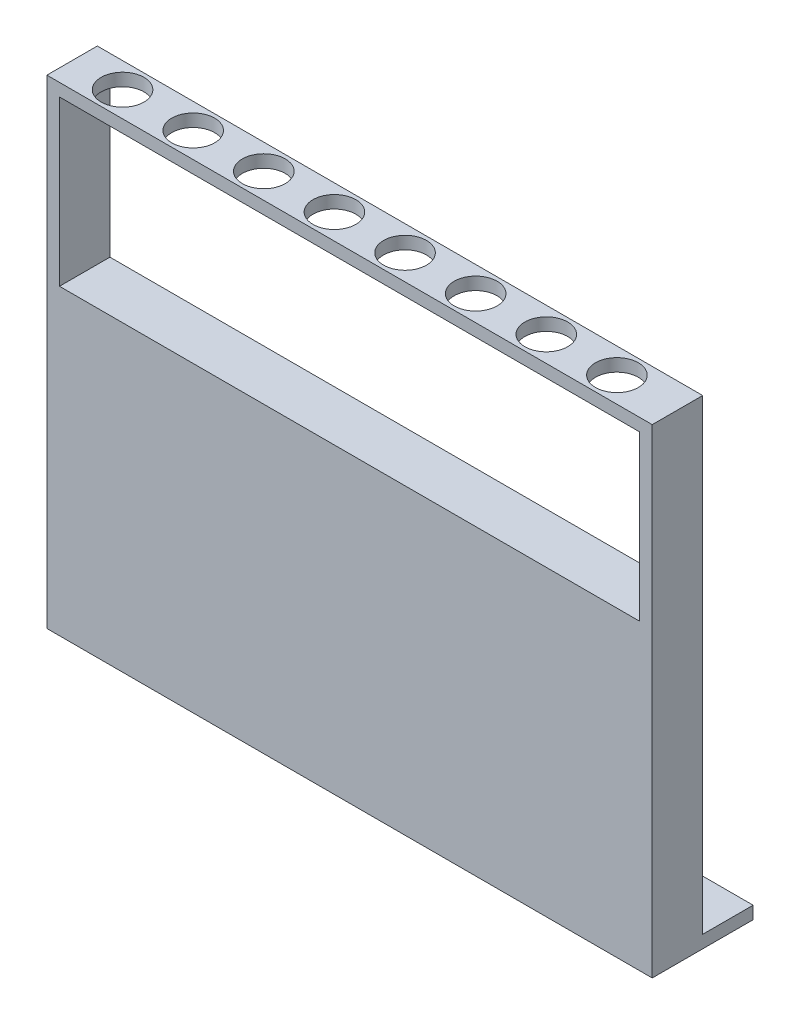
ISO-10303-21;
HEADER;
FILE_DESCRIPTION(('STEP AP214'),'2;1');
FILE_NAME('part.step','',(''),(''),'','','');
FILE_SCHEMA(('AUTOMOTIVE_DESIGN { 1 0 10303 214 1 1 1 1 }'));
ENDSEC;
DATA;
#1=APPLICATION_CONTEXT('core data for automotive mechanical design processes');
#2=APPLICATION_PROTOCOL_DEFINITION('international standard','automotive_design',2000,#1);
#3=PRODUCT_CONTEXT('',#1,'mechanical');
#4=PRODUCT('Part','Part','',(#3));
#5=PRODUCT_RELATED_PRODUCT_CATEGORY('part','',(#4));
#6=PRODUCT_DEFINITION_FORMATION('','',#4);
#7=PRODUCT_DEFINITION_CONTEXT('part definition',#1,'design');
#8=PRODUCT_DEFINITION('design','',#6,#7);
#9=PRODUCT_DEFINITION_SHAPE('','',#8);
#10=(LENGTH_UNIT() NAMED_UNIT(*) SI_UNIT(.MILLI.,.METRE.));
#11=(NAMED_UNIT(*) PLANE_ANGLE_UNIT() SI_UNIT($,.RADIAN.));
#12=(NAMED_UNIT(*) SI_UNIT($,.STERADIAN.) SOLID_ANGLE_UNIT());
#13=UNCERTAINTY_MEASURE_WITH_UNIT(LENGTH_MEASURE(1.E-05),#10,'distance_accuracy_value','');
#14=(GEOMETRIC_REPRESENTATION_CONTEXT(3) GLOBAL_UNCERTAINTY_ASSIGNED_CONTEXT((#13)) GLOBAL_UNIT_ASSIGNED_CONTEXT((#10,
#11,#12)) REPRESENTATION_CONTEXT('',''));
#15=CARTESIAN_POINT('',(0.,0.,0.));
#16=DIRECTION('',(0.,0.,1.));
#17=DIRECTION('',(1.,0.,0.));
#18=AXIS2_PLACEMENT_3D('',#15,#16,#17);
#19=CARTESIAN_POINT('',(-76.2,76.2,-6.35));
#20=DIRECTION('',(0.,0.,1.));
#21=DIRECTION('',(1.,0.,0.));
#22=AXIS2_PLACEMENT_3D('',#19,#20,#21);
#23=PLANE('',#22);
#24=DIRECTION('',(-1.,0.,0.));
#25=VECTOR('',#24,1.);
#26=CARTESIAN_POINT('',(-76.2,76.2,-6.35));
#27=LINE('',#26,#25);
#28=CARTESIAN_POINT('',(73.025,76.2,-6.34999999999999));
#29=VERTEX_POINT('',#28);
#30=CARTESIAN_POINT('',(-73.025,76.2,-6.35));
#31=VERTEX_POINT('',#30);
#32=EDGE_CURVE('E214',#29,#31,#27,.T.);
#33=ORIENTED_EDGE('',*,*,#32,.F.);
#34=DIRECTION('',(0.,1.,0.));
#35=VECTOR('',#34,1.);
#36=CARTESIAN_POINT('',(73.025,76.2,-6.34999999999999));
#37=LINE('',#36,#35);
#38=CARTESIAN_POINT('',(73.025,117.475,-6.34999999999999));
#39=VERTEX_POINT('',#38);
#40=EDGE_CURVE('E255',#29,#39,#37,.T.);
#41=ORIENTED_EDGE('',*,*,#40,.T.);
#42=DIRECTION('',(-1.,0.,0.));
#43=VECTOR('',#42,1.);
#44=CARTESIAN_POINT('',(73.025,117.475,-6.34999999999999));
#45=LINE('',#44,#43);
#46=CARTESIAN_POINT('',(-73.025,117.475,-6.34999999999999));
#47=VERTEX_POINT('',#46);
#48=EDGE_CURVE('E149',#39,#47,#45,.T.);
#49=ORIENTED_EDGE('',*,*,#48,.T.);
#50=DIRECTION('',(0.,-1.,0.));
#51=VECTOR('',#50,1.);
#52=CARTESIAN_POINT('',(-73.025,117.475,-6.34999999999999));
#53=LINE('',#52,#51);
#54=EDGE_CURVE('E117',#47,#31,#53,.T.);
#55=ORIENTED_EDGE('',*,*,#54,.T.);
#56=EDGE_LOOP('',(#33,#41,#49,#55));
#57=FACE_BOUND('',#56,.T.);
#58=DIRECTION('',(1.,0.,0.));
#59=VECTOR('',#58,1.);
#60=CARTESIAN_POINT('',(-76.2,3.175,-6.35));
#61=LINE('',#60,#59);
#62=CARTESIAN_POINT('',(-76.2,3.17500000000003,-6.35));
#63=VERTEX_POINT('',#62);
#64=CARTESIAN_POINT('',(76.2,3.175,-6.35));
#65=VERTEX_POINT('',#64);
#66=EDGE_CURVE('E198',#63,#65,#61,.T.);
#67=ORIENTED_EDGE('',*,*,#66,.F.);
#68=DIRECTION('',(0.,-1.,0.));
#69=VECTOR('',#68,1.);
#70=CARTESIAN_POINT('',(-76.2,76.2,-6.35));
#71=LINE('',#70,#69);
#72=CARTESIAN_POINT('',(-76.2,120.65,-6.34999999999999));
#73=VERTEX_POINT('',#72);
#74=EDGE_CURVE('E43',#73,#63,#71,.T.);
#75=ORIENTED_EDGE('',*,*,#74,.F.);
#76=DIRECTION('',(1.,0.,0.));
#77=VECTOR('',#76,1.);
#78=CARTESIAN_POINT('',(-76.2,120.65,-6.34999999999999));
#79=LINE('',#78,#77);
#80=CARTESIAN_POINT('',(76.2,120.65,-6.34999999999999));
#81=VERTEX_POINT('',#80);
#82=EDGE_CURVE('E139',#73,#81,#79,.T.);
#83=ORIENTED_EDGE('',*,*,#82,.T.);
#84=DIRECTION('',(0.,-1.,0.));
#85=VECTOR('',#84,1.);
#86=CARTESIAN_POINT('',(76.2,76.2,-6.35));
#87=LINE('',#86,#85);
#88=EDGE_CURVE('E11',#81,#65,#87,.T.);
#89=ORIENTED_EDGE('',*,*,#88,.T.);
#90=EDGE_LOOP('',(#67,#75,#83,#89));
#91=FACE_BOUND('',#90,.T.);
#92=ADVANCED_FACE('F35',(#57,#91),#23,.F.);
#93=CARTESIAN_POINT('',(76.2,76.2,6.35));
#94=DIRECTION('',(-1.,0.,0.));
#95=DIRECTION('',(0.,0.,1.));
#96=AXIS2_PLACEMENT_3D('',#93,#94,#95);
#97=PLANE('',#96);
#98=DIRECTION('',(0.,0.,-1.));
#99=VECTOR('',#98,1.);
#100=CARTESIAN_POINT('',(76.2,0.,6.35));
#101=LINE('',#100,#99);
#102=CARTESIAN_POINT('',(76.2,0.,6.35));
#103=VERTEX_POINT('',#102);
#104=CARTESIAN_POINT('',(76.2,0.,-19.05));
#105=VERTEX_POINT('',#104);
#106=EDGE_CURVE('E213',#103,#105,#101,.T.);
#107=ORIENTED_EDGE('',*,*,#106,.T.);
#108=DIRECTION('',(0.,-1.,0.));
#109=VECTOR('',#108,1.);
#110=CARTESIAN_POINT('',(76.2,3.175,-19.05));
#111=LINE('',#110,#109);
#112=CARTESIAN_POINT('',(76.2,3.175,-19.05));
#113=VERTEX_POINT('',#112);
#114=EDGE_CURVE('E210',#113,#105,#111,.T.);
#115=ORIENTED_EDGE('',*,*,#114,.F.);
#116=DIRECTION('',(0.,0.,-1.));
#117=VECTOR('',#116,1.);
#118=CARTESIAN_POINT('',(76.2,3.175,-6.35));
#119=LINE('',#118,#117);
#120=EDGE_CURVE('E201',#65,#113,#119,.T.);
#121=ORIENTED_EDGE('',*,*,#120,.F.);
#122=ORIENTED_EDGE('',*,*,#88,.F.);
#123=DIRECTION('',(0.,0.,1.));
#124=VECTOR('',#123,1.);
#125=CARTESIAN_POINT('',(76.2,120.65,-165.1));
#126=LINE('',#125,#124);
#127=CARTESIAN_POINT('',(76.2,120.65,6.35));
#128=VERTEX_POINT('',#127);
#129=EDGE_CURVE('E150',#81,#128,#126,.T.);
#130=ORIENTED_EDGE('',*,*,#129,.T.);
#131=DIRECTION('',(0.,-1.,0.));
#132=VECTOR('',#131,1.);
#133=CARTESIAN_POINT('',(76.2,76.2,6.35));
#134=LINE('',#133,#132);
#135=EDGE_CURVE('E218',#128,#103,#134,.T.);
#136=ORIENTED_EDGE('',*,*,#135,.T.);
#137=EDGE_LOOP('',(#107,#115,#121,#122,#130,#136));
#138=FACE_BOUND('',#137,.T.);
#139=ADVANCED_FACE('F37',(#138),#97,.F.);
#140=CARTESIAN_POINT('',(-76.2,76.2,6.35));
#141=DIRECTION('',(1.,0.,0.));
#142=DIRECTION('',(0.,0.,-1.));
#143=AXIS2_PLACEMENT_3D('',#140,#141,#142);
#144=PLANE('',#143);
#145=DIRECTION('',(0.,0.,1.));
#146=VECTOR('',#145,1.);
#147=CARTESIAN_POINT('',(-76.2,0.,6.35));
#148=LINE('',#147,#146);
#149=CARTESIAN_POINT('',(-76.2,0.,-19.05));
#150=VERTEX_POINT('',#149);
#151=CARTESIAN_POINT('',(-76.2,0.,6.35));
#152=VERTEX_POINT('',#151);
#153=EDGE_CURVE('E220',#150,#152,#148,.T.);
#154=ORIENTED_EDGE('',*,*,#153,.T.);
#155=DIRECTION('',(0.,-1.,0.));
#156=VECTOR('',#155,1.);
#157=CARTESIAN_POINT('',(-76.2,76.2,6.35));
#158=LINE('',#157,#156);
#159=CARTESIAN_POINT('',(-76.2,120.65,6.35));
#160=VERTEX_POINT('',#159);
#161=EDGE_CURVE('E225',#160,#152,#158,.T.);
#162=ORIENTED_EDGE('',*,*,#161,.F.);
#163=DIRECTION('',(0.,0.,1.));
#164=VECTOR('',#163,1.);
#165=CARTESIAN_POINT('',(-76.2,120.65,-165.1));
#166=LINE('',#165,#164);
#167=EDGE_CURVE('E146',#73,#160,#166,.T.);
#168=ORIENTED_EDGE('',*,*,#167,.F.);
#169=ORIENTED_EDGE('',*,*,#74,.T.);
#170=DIRECTION('',(0.,0.,1.));
#171=VECTOR('',#170,1.);
#172=CARTESIAN_POINT('',(-76.2,3.175,-12.7));
#173=LINE('',#172,#171);
#174=CARTESIAN_POINT('',(-76.2,3.175,-19.05));
#175=VERTEX_POINT('',#174);
#176=EDGE_CURVE('E195',#175,#63,#173,.T.);
#177=ORIENTED_EDGE('',*,*,#176,.F.);
#178=DIRECTION('',(0.,-1.,0.));
#179=VECTOR('',#178,1.);
#180=CARTESIAN_POINT('',(-76.2,3.175,-19.05));
#181=LINE('',#180,#179);
#182=EDGE_CURVE('E205',#175,#150,#181,.T.);
#183=ORIENTED_EDGE('',*,*,#182,.T.);
#184=EDGE_LOOP('',(#154,#162,#168,#169,#177,#183));
#185=FACE_BOUND('',#184,.T.);
#186=ADVANCED_FACE('F231',(#185),#144,.F.);
#187=CARTESIAN_POINT('',(-76.2,76.2,6.35));
#188=DIRECTION('',(0.,0.,-1.));
#189=DIRECTION('',(-1.,0.,0.));
#190=AXIS2_PLACEMENT_3D('',#187,#188,#189);
#191=PLANE('',#190);
#192=DIRECTION('',(1.,0.,0.));
#193=VECTOR('',#192,1.);
#194=CARTESIAN_POINT('',(-76.2,76.2,6.35));
#195=LINE('',#194,#193);
#196=CARTESIAN_POINT('',(-73.025,76.2,6.35));
#197=VERTEX_POINT('',#196);
#198=CARTESIAN_POINT('',(73.025,76.2,6.35));
#199=VERTEX_POINT('',#198);
#200=EDGE_CURVE('E50',#197,#199,#195,.T.);
#201=ORIENTED_EDGE('',*,*,#200,.F.);
#202=DIRECTION('',(0.,1.,0.));
#203=VECTOR('',#202,1.);
#204=CARTESIAN_POINT('',(-73.025,117.475,6.35));
#205=LINE('',#204,#203);
#206=CARTESIAN_POINT('',(-73.025,117.475,6.35));
#207=VERTEX_POINT('',#206);
#208=EDGE_CURVE('E115',#197,#207,#205,.T.);
#209=ORIENTED_EDGE('',*,*,#208,.T.);
#210=DIRECTION('',(1.,0.,0.));
#211=VECTOR('',#210,1.);
#212=CARTESIAN_POINT('',(73.025,117.475,6.35));
#213=LINE('',#212,#211);
#214=CARTESIAN_POINT('',(73.025,117.475,6.35));
#215=VERTEX_POINT('',#214);
#216=EDGE_CURVE('E123',#207,#215,#213,.T.);
#217=ORIENTED_EDGE('',*,*,#216,.T.);
#218=DIRECTION('',(0.,-1.,0.));
#219=VECTOR('',#218,1.);
#220=CARTESIAN_POINT('',(73.025,76.2,6.35));
#221=LINE('',#220,#219);
#222=EDGE_CURVE('E129',#215,#199,#221,.T.);
#223=ORIENTED_EDGE('',*,*,#222,.T.);
#224=EDGE_LOOP('',(#201,#209,#217,#223));
#225=FACE_BOUND('',#224,.T.);
#226=DIRECTION('',(1.,0.,0.));
#227=VECTOR('',#226,1.);
#228=CARTESIAN_POINT('',(-76.2,0.,6.35));
#229=LINE('',#228,#227);
#230=EDGE_CURVE('E216',#152,#103,#229,.T.);
#231=ORIENTED_EDGE('',*,*,#230,.T.);
#232=ORIENTED_EDGE('',*,*,#135,.F.);
#233=DIRECTION('',(-1.,0.,0.));
#234=VECTOR('',#233,1.);
#235=CARTESIAN_POINT('',(-76.2,120.65,6.35));
#236=LINE('',#235,#234);
#237=EDGE_CURVE('E143',#128,#160,#236,.T.);
#238=ORIENTED_EDGE('',*,*,#237,.T.);
#239=ORIENTED_EDGE('',*,*,#161,.T.);
#240=EDGE_LOOP('',(#231,#232,#238,#239));
#241=FACE_BOUND('',#240,.T.);
#242=ADVANCED_FACE('F131',(#225,#241),#191,.F.);
#243=CARTESIAN_POINT('',(0.,76.2,0.));
#244=DIRECTION('',(0.,-1.,0.));
#245=DIRECTION('',(0.,0.,-1.));
#246=AXIS2_PLACEMENT_3D('',#243,#244,#245);
#247=PLANE('',#246);
#248=ORIENTED_EDGE('',*,*,#200,.T.);
#249=DIRECTION('',(0.,0.,1.));
#250=VECTOR('',#249,1.);
#251=CARTESIAN_POINT('',(73.025,76.2,-165.1));
#252=LINE('',#251,#250);
#253=EDGE_CURVE('E153',#29,#199,#252,.T.);
#254=ORIENTED_EDGE('',*,*,#253,.F.);
#255=ORIENTED_EDGE('',*,*,#32,.T.);
#256=DIRECTION('',(0.,0.,1.));
#257=VECTOR('',#256,1.);
#258=CARTESIAN_POINT('',(-73.025,76.2,-165.1));
#259=LINE('',#258,#257);
#260=EDGE_CURVE('E55',#31,#197,#259,.T.);
#261=ORIENTED_EDGE('',*,*,#260,.T.);
#262=EDGE_LOOP('',(#248,#254,#255,#261));
#263=FACE_BOUND('',#262,.T.);
#264=ADVANCED_FACE('F349',(#263),#247,.F.);
#265=CARTESIAN_POINT('',(0.,0.,0.));
#266=DIRECTION('',(0.,-1.,0.));
#267=DIRECTION('',(0.,0.,-1.));
#268=AXIS2_PLACEMENT_3D('',#265,#266,#267);
#269=PLANE('',#268);
#270=ORIENTED_EDGE('',*,*,#106,.F.);
#271=ORIENTED_EDGE('',*,*,#230,.F.);
#272=ORIENTED_EDGE('',*,*,#153,.F.);
#273=DIRECTION('',(-1.,0.,0.));
#274=VECTOR('',#273,1.);
#275=CARTESIAN_POINT('',(76.2,0.,-19.05));
#276=LINE('',#275,#274);
#277=EDGE_CURVE('E192',#105,#150,#276,.T.);
#278=ORIENTED_EDGE('',*,*,#277,.F.);
#279=EDGE_LOOP('',(#270,#271,#272,#278));
#280=FACE_BOUND('',#279,.T.);
#281=CARTESIAN_POINT('',(-69.85,0.,-12.7));
#282=DIRECTION('',(0.,1.,0.));
#283=DIRECTION('',(0.,0.,1.));
#284=AXIS2_PLACEMENT_3D('',#281,#282,#283);
#285=CIRCLE('',#284,3.175);
#286=CARTESIAN_POINT('',(-69.85,0.,-9.52499999999999));
#287=VERTEX_POINT('',#286);
#288=EDGE_CURVE('E186',#287,#287,#285,.T.);
#289=ORIENTED_EDGE('',*,*,#288,.T.);
#290=EDGE_LOOP('',(#289));
#291=FACE_BOUND('',#290,.T.);
#292=CARTESIAN_POINT('',(-44.45,0.,-12.7));
#293=DIRECTION('',(0.,1.,0.));
#294=DIRECTION('',(0.,0.,1.));
#295=AXIS2_PLACEMENT_3D('',#292,#293,#294);
#296=CIRCLE('',#295,3.175);
#297=CARTESIAN_POINT('',(-44.45,0.,-9.52499999999999));
#298=VERTEX_POINT('',#297);
#299=EDGE_CURVE('E180',#298,#298,#296,.T.);
#300=ORIENTED_EDGE('',*,*,#299,.T.);
#301=EDGE_LOOP('',(#300));
#302=FACE_BOUND('',#301,.T.);
#303=CARTESIAN_POINT('',(-19.05,0.,-12.7));
#304=DIRECTION('',(0.,1.,0.));
#305=DIRECTION('',(0.,0.,1.));
#306=AXIS2_PLACEMENT_3D('',#303,#304,#305);
#307=CIRCLE('',#306,3.175);
#308=CARTESIAN_POINT('',(-19.05,0.,-9.52499999999999));
#309=VERTEX_POINT('',#308);
#310=EDGE_CURVE('E174',#309,#309,#307,.T.);
#311=ORIENTED_EDGE('',*,*,#310,.T.);
#312=EDGE_LOOP('',(#311));
#313=FACE_BOUND('',#312,.T.);
#314=CARTESIAN_POINT('',(6.34999999999997,0.,-12.7));
#315=DIRECTION('',(0.,1.,0.));
#316=DIRECTION('',(0.,0.,1.));
#317=AXIS2_PLACEMENT_3D('',#314,#315,#316);
#318=CIRCLE('',#317,3.175);
#319=CARTESIAN_POINT('',(6.34999999999997,0.,-9.52499999999999));
#320=VERTEX_POINT('',#319);
#321=EDGE_CURVE('E168',#320,#320,#318,.T.);
#322=ORIENTED_EDGE('',*,*,#321,.T.);
#323=EDGE_LOOP('',(#322));
#324=FACE_BOUND('',#323,.T.);
#325=CARTESIAN_POINT('',(31.75,0.,-12.7));
#326=DIRECTION('',(0.,1.,0.));
#327=DIRECTION('',(0.,0.,1.));
#328=AXIS2_PLACEMENT_3D('',#325,#326,#327);
#329=CIRCLE('',#328,3.175);
#330=CARTESIAN_POINT('',(31.75,0.,-9.52499999999999));
#331=VERTEX_POINT('',#330);
#332=EDGE_CURVE('E162',#331,#331,#329,.T.);
#333=ORIENTED_EDGE('',*,*,#332,.T.);
#334=EDGE_LOOP('',(#333));
#335=FACE_BOUND('',#334,.T.);
#336=CARTESIAN_POINT('',(57.15,0.,-12.7));
#337=DIRECTION('',(0.,1.,0.));
#338=DIRECTION('',(0.,0.,1.));
#339=AXIS2_PLACEMENT_3D('',#336,#337,#338);
#340=CIRCLE('',#339,3.175);
#341=CARTESIAN_POINT('',(57.15,0.,-9.52499999999999));
#342=VERTEX_POINT('',#341);
#343=EDGE_CURVE('E158',#342,#342,#340,.T.);
#344=ORIENTED_EDGE('',*,*,#343,.T.);
#345=EDGE_LOOP('',(#344));
#346=FACE_BOUND('',#345,.T.);
#347=ADVANCED_FACE('F249',(#280,#291,#302,#313,#324,#335,#346),#269,.T.);
#348=CARTESIAN_POINT('',(0.,3.175,0.));
#349=DIRECTION('',(0.,1.,0.));
#350=DIRECTION('',(0.,0.,1.));
#351=AXIS2_PLACEMENT_3D('',#348,#349,#350);
#352=PLANE('',#351);
#353=CARTESIAN_POINT('',(31.75,3.175,-12.7));
#354=DIRECTION('',(0.,1.,0.));
#355=DIRECTION('',(0.,0.,1.));
#356=AXIS2_PLACEMENT_3D('',#353,#354,#355);
#357=CIRCLE('',#356,3.175);
#358=CARTESIAN_POINT('',(31.75,3.175,-9.52499999999999));
#359=VERTEX_POINT('',#358);
#360=EDGE_CURVE('E165',#359,#359,#357,.T.);
#361=ORIENTED_EDGE('',*,*,#360,.F.);
#362=EDGE_LOOP('',(#361));
#363=FACE_BOUND('',#362,.T.);
#364=CARTESIAN_POINT('',(-19.05,3.175,-12.7));
#365=DIRECTION('',(0.,1.,0.));
#366=DIRECTION('',(0.,0.,1.));
#367=AXIS2_PLACEMENT_3D('',#364,#365,#366);
#368=CIRCLE('',#367,3.175);
#369=CARTESIAN_POINT('',(-19.05,3.175,-9.52499999999999));
#370=VERTEX_POINT('',#369);
#371=EDGE_CURVE('E177',#370,#370,#368,.T.);
#372=ORIENTED_EDGE('',*,*,#371,.F.);
#373=EDGE_LOOP('',(#372));
#374=FACE_BOUND('',#373,.T.);
#375=CARTESIAN_POINT('',(-69.85,3.175,-12.7));
#376=DIRECTION('',(0.,1.,0.));
#377=DIRECTION('',(0.,0.,1.));
#378=AXIS2_PLACEMENT_3D('',#375,#376,#377);
#379=CIRCLE('',#378,3.175);
#380=CARTESIAN_POINT('',(-69.85,3.175,-9.52499999999999));
#381=VERTEX_POINT('',#380);
#382=EDGE_CURVE('E189',#381,#381,#379,.T.);
#383=ORIENTED_EDGE('',*,*,#382,.F.);
#384=EDGE_LOOP('',(#383));
#385=FACE_BOUND('',#384,.T.);
#386=ORIENTED_EDGE('',*,*,#176,.T.);
#387=ORIENTED_EDGE('',*,*,#66,.T.);
#388=ORIENTED_EDGE('',*,*,#120,.T.);
#389=DIRECTION('',(-1.,0.,0.));
#390=VECTOR('',#389,1.);
#391=CARTESIAN_POINT('',(76.2,3.175,-19.05));
#392=LINE('',#391,#390);
#393=EDGE_CURVE('E203',#113,#175,#392,.T.);
#394=ORIENTED_EDGE('',*,*,#393,.T.);
#395=EDGE_LOOP('',(#386,#387,#388,#394));
#396=FACE_BOUND('',#395,.T.);
#397=CARTESIAN_POINT('',(-44.45,3.175,-12.7));
#398=DIRECTION('',(0.,1.,0.));
#399=DIRECTION('',(0.,0.,1.));
#400=AXIS2_PLACEMENT_3D('',#397,#398,#399);
#401=CIRCLE('',#400,3.175);
#402=CARTESIAN_POINT('',(-44.45,3.175,-9.52499999999999));
#403=VERTEX_POINT('',#402);
#404=EDGE_CURVE('E183',#403,#403,#401,.T.);
#405=ORIENTED_EDGE('',*,*,#404,.F.);
#406=EDGE_LOOP('',(#405));
#407=FACE_BOUND('',#406,.T.);
#408=CARTESIAN_POINT('',(6.34999999999997,3.175,-12.7));
#409=DIRECTION('',(0.,1.,0.));
#410=DIRECTION('',(0.,0.,1.));
#411=AXIS2_PLACEMENT_3D('',#408,#409,#410);
#412=CIRCLE('',#411,3.175);
#413=CARTESIAN_POINT('',(6.34999999999997,3.175,-9.52499999999999));
#414=VERTEX_POINT('',#413);
#415=EDGE_CURVE('E171',#414,#414,#412,.T.);
#416=ORIENTED_EDGE('',*,*,#415,.F.);
#417=EDGE_LOOP('',(#416));
#418=FACE_BOUND('',#417,.T.);
#419=CARTESIAN_POINT('',(57.15,3.175,-12.7));
#420=DIRECTION('',(0.,1.,0.));
#421=DIRECTION('',(0.,0.,1.));
#422=AXIS2_PLACEMENT_3D('',#419,#420,#421);
#423=CIRCLE('',#422,3.175);
#424=CARTESIAN_POINT('',(57.15,3.175,-9.52499999999999));
#425=VERTEX_POINT('',#424);
#426=EDGE_CURVE('E159',#425,#425,#423,.T.);
#427=ORIENTED_EDGE('',*,*,#426,.F.);
#428=EDGE_LOOP('',(#427));
#429=FACE_BOUND('',#428,.T.);
#430=ADVANCED_FACE('F236',(#363,#374,#385,#396,#407,#418,#429),#352,.T.);
#431=CARTESIAN_POINT('',(76.2,3.175,-19.05));
#432=DIRECTION('',(0.,0.,1.));
#433=DIRECTION('',(1.,0.,0.));
#434=AXIS2_PLACEMENT_3D('',#431,#432,#433);
#435=PLANE('',#434);
#436=ORIENTED_EDGE('',*,*,#277,.T.);
#437=ORIENTED_EDGE('',*,*,#182,.F.);
#438=ORIENTED_EDGE('',*,*,#393,.F.);
#439=ORIENTED_EDGE('',*,*,#114,.T.);
#440=EDGE_LOOP('',(#436,#437,#438,#439));
#441=FACE_BOUND('',#440,.T.);
#442=ADVANCED_FACE('F243',(#441),#435,.F.);
#443=CARTESIAN_POINT('',(-69.85,3.175,-12.7));
#444=DIRECTION('',(0.,-1.,0.));
#445=DIRECTION('',(0.,0.,-1.));
#446=AXIS2_PLACEMENT_3D('',#443,#444,#445);
#447=CYLINDRICAL_SURFACE('',#446,3.175);
#448=ORIENTED_EDGE('',*,*,#382,.T.);
#449=EDGE_LOOP('',(#448));
#450=FACE_BOUND('',#449,.T.);
#451=ORIENTED_EDGE('',*,*,#288,.F.);
#452=EDGE_LOOP('',(#451));
#453=FACE_BOUND('',#452,.T.);
#454=ADVANCED_FACE('F356',(#450,#453),#447,.F.);
#455=CARTESIAN_POINT('',(-44.45,3.175,-12.7));
#456=DIRECTION('',(0.,-1.,0.));
#457=DIRECTION('',(0.,0.,-1.));
#458=AXIS2_PLACEMENT_3D('',#455,#456,#457);
#459=CYLINDRICAL_SURFACE('',#458,3.175);
#460=ORIENTED_EDGE('',*,*,#404,.T.);
#461=EDGE_LOOP('',(#460));
#462=FACE_BOUND('',#461,.T.);
#463=ORIENTED_EDGE('',*,*,#299,.F.);
#464=EDGE_LOOP('',(#463));
#465=FACE_BOUND('',#464,.T.);
#466=ADVANCED_FACE('F362',(#462,#465),#459,.F.);
#467=CARTESIAN_POINT('',(-19.05,3.175,-12.7));
#468=DIRECTION('',(0.,-1.,0.));
#469=DIRECTION('',(0.,0.,-1.));
#470=AXIS2_PLACEMENT_3D('',#467,#468,#469);
#471=CYLINDRICAL_SURFACE('',#470,3.175);
#472=ORIENTED_EDGE('',*,*,#371,.T.);
#473=EDGE_LOOP('',(#472));
#474=FACE_BOUND('',#473,.T.);
#475=ORIENTED_EDGE('',*,*,#310,.F.);
#476=EDGE_LOOP('',(#475));
#477=FACE_BOUND('',#476,.T.);
#478=ADVANCED_FACE('F366',(#474,#477),#471,.F.);
#479=CARTESIAN_POINT('',(6.34999999999997,3.175,-12.7));
#480=DIRECTION('',(0.,-1.,0.));
#481=DIRECTION('',(0.,0.,-1.));
#482=AXIS2_PLACEMENT_3D('',#479,#480,#481);
#483=CYLINDRICAL_SURFACE('',#482,3.175);
#484=ORIENTED_EDGE('',*,*,#415,.T.);
#485=EDGE_LOOP('',(#484));
#486=FACE_BOUND('',#485,.T.);
#487=ORIENTED_EDGE('',*,*,#321,.F.);
#488=EDGE_LOOP('',(#487));
#489=FACE_BOUND('',#488,.T.);
#490=ADVANCED_FACE('F370',(#486,#489),#483,.F.);
#491=CARTESIAN_POINT('',(31.75,3.175,-12.7));
#492=DIRECTION('',(0.,-1.,0.));
#493=DIRECTION('',(0.,0.,-1.));
#494=AXIS2_PLACEMENT_3D('',#491,#492,#493);
#495=CYLINDRICAL_SURFACE('',#494,3.175);
#496=ORIENTED_EDGE('',*,*,#360,.T.);
#497=EDGE_LOOP('',(#496));
#498=FACE_BOUND('',#497,.T.);
#499=ORIENTED_EDGE('',*,*,#332,.F.);
#500=EDGE_LOOP('',(#499));
#501=FACE_BOUND('',#500,.T.);
#502=ADVANCED_FACE('F374',(#498,#501),#495,.F.);
#503=CARTESIAN_POINT('',(57.15,3.175,-12.7));
#504=DIRECTION('',(0.,-1.,0.));
#505=DIRECTION('',(0.,0.,-1.));
#506=AXIS2_PLACEMENT_3D('',#503,#504,#505);
#507=CYLINDRICAL_SURFACE('',#506,3.175);
#508=ORIENTED_EDGE('',*,*,#426,.T.);
#509=EDGE_LOOP('',(#508));
#510=FACE_BOUND('',#509,.T.);
#511=ORIENTED_EDGE('',*,*,#343,.F.);
#512=EDGE_LOOP('',(#511));
#513=FACE_BOUND('',#512,.T.);
#514=ADVANCED_FACE('F310',(#510,#513),#507,.F.);
#515=CARTESIAN_POINT('',(-76.2,120.65,-165.1));
#516=DIRECTION('',(0.,1.,0.));
#517=DIRECTION('',(0.,0.,1.));
#518=AXIS2_PLACEMENT_3D('',#515,#516,#517);
#519=PLANE('',#518);
#520=CARTESIAN_POINT('',(-45.72,120.65,0.));
#521=DIRECTION('',(0.,1.,0.));
#522=DIRECTION('',(0.,0.,1.));
#523=AXIS2_PLACEMENT_3D('',#520,#521,#522);
#524=CIRCLE('',#523,5.3975);
#525=CARTESIAN_POINT('',(-45.72,120.65,5.3975));
#526=VERTEX_POINT('',#525);
#527=EDGE_CURVE('E261',#526,#526,#524,.T.);
#528=ORIENTED_EDGE('',*,*,#527,.F.);
#529=EDGE_LOOP('',(#528));
#530=FACE_BOUND('',#529,.T.);
#531=CARTESIAN_POINT('',(-27.94,120.65,0.));
#532=DIRECTION('',(0.,1.,0.));
#533=DIRECTION('',(0.,0.,1.));
#534=AXIS2_PLACEMENT_3D('',#531,#532,#533);
#535=CIRCLE('',#534,5.3975);
#536=CARTESIAN_POINT('',(-27.94,120.65,5.3975));
#537=VERTEX_POINT('',#536);
#538=EDGE_CURVE('E296',#537,#537,#535,.T.);
#539=ORIENTED_EDGE('',*,*,#538,.F.);
#540=EDGE_LOOP('',(#539));
#541=FACE_BOUND('',#540,.T.);
#542=CARTESIAN_POINT('',(-10.16,120.65,0.));
#543=DIRECTION('',(0.,1.,0.));
#544=DIRECTION('',(0.,0.,1.));
#545=AXIS2_PLACEMENT_3D('',#542,#543,#544);
#546=CIRCLE('',#545,5.3975);
#547=CARTESIAN_POINT('',(-10.16,120.65,5.3975));
#548=VERTEX_POINT('',#547);
#549=EDGE_CURVE('E290',#548,#548,#546,.T.);
#550=ORIENTED_EDGE('',*,*,#549,.F.);
#551=EDGE_LOOP('',(#550));
#552=FACE_BOUND('',#551,.T.);
#553=CARTESIAN_POINT('',(7.61999999999997,120.65,0.));
#554=DIRECTION('',(0.,1.,0.));
#555=DIRECTION('',(0.,0.,1.));
#556=AXIS2_PLACEMENT_3D('',#553,#554,#555);
#557=CIRCLE('',#556,5.3975);
#558=CARTESIAN_POINT('',(7.61999999999997,120.65,5.3975));
#559=VERTEX_POINT('',#558);
#560=EDGE_CURVE('E284',#559,#559,#557,.T.);
#561=ORIENTED_EDGE('',*,*,#560,.F.);
#562=EDGE_LOOP('',(#561));
#563=FACE_BOUND('',#562,.T.);
#564=CARTESIAN_POINT('',(25.4,120.65,0.));
#565=DIRECTION('',(0.,1.,0.));
#566=DIRECTION('',(0.,0.,1.));
#567=AXIS2_PLACEMENT_3D('',#564,#565,#566);
#568=CIRCLE('',#567,5.3975);
#569=CARTESIAN_POINT('',(25.4,120.65,5.3975));
#570=VERTEX_POINT('',#569);
#571=EDGE_CURVE('E278',#570,#570,#568,.T.);
#572=ORIENTED_EDGE('',*,*,#571,.F.);
#573=EDGE_LOOP('',(#572));
#574=FACE_BOUND('',#573,.T.);
#575=CARTESIAN_POINT('',(43.18,120.65,0.));
#576=DIRECTION('',(0.,1.,0.));
#577=DIRECTION('',(0.,0.,1.));
#578=AXIS2_PLACEMENT_3D('',#575,#576,#577);
#579=CIRCLE('',#578,5.3975);
#580=CARTESIAN_POINT('',(43.18,120.65,5.3975));
#581=VERTEX_POINT('',#580);
#582=EDGE_CURVE('E272',#581,#581,#579,.T.);
#583=ORIENTED_EDGE('',*,*,#582,.F.);
#584=EDGE_LOOP('',(#583));
#585=FACE_BOUND('',#584,.T.);
#586=CARTESIAN_POINT('',(60.96,120.65,0.));
#587=DIRECTION('',(0.,1.,0.));
#588=DIRECTION('',(0.,0.,1.));
#589=AXIS2_PLACEMENT_3D('',#586,#587,#588);
#590=CIRCLE('',#589,5.3975);
#591=CARTESIAN_POINT('',(60.96,120.65,5.3975));
#592=VERTEX_POINT('',#591);
#593=EDGE_CURVE('E266',#592,#592,#590,.T.);
#594=ORIENTED_EDGE('',*,*,#593,.F.);
#595=EDGE_LOOP('',(#594));
#596=FACE_BOUND('',#595,.T.);
#597=CARTESIAN_POINT('',(-63.5,120.65,0.));
#598=DIRECTION('',(0.,1.,0.));
#599=DIRECTION('',(0.,0.,1.));
#600=AXIS2_PLACEMENT_3D('',#597,#598,#599);
#601=CIRCLE('',#600,5.3975);
#602=CARTESIAN_POINT('',(-63.5,120.65,5.3975));
#603=VERTEX_POINT('',#602);
#604=EDGE_CURVE('E133',#603,#603,#601,.T.);
#605=ORIENTED_EDGE('',*,*,#604,.F.);
#606=EDGE_LOOP('',(#605));
#607=FACE_BOUND('',#606,.T.);
#608=ORIENTED_EDGE('',*,*,#82,.F.);
#609=ORIENTED_EDGE('',*,*,#167,.T.);
#610=ORIENTED_EDGE('',*,*,#237,.F.);
#611=ORIENTED_EDGE('',*,*,#129,.F.);
#612=EDGE_LOOP('',(#608,#609,#610,#611));
#613=FACE_BOUND('',#612,.T.);
#614=ADVANCED_FACE('F254',(#530,#541,#552,#563,#574,#585,#596,#607,#613),#519,.T.);
#615=CARTESIAN_POINT('',(73.025,76.2,-165.1));
#616=DIRECTION('',(-1.,0.,0.));
#617=DIRECTION('',(0.,0.,1.));
#618=AXIS2_PLACEMENT_3D('',#615,#616,#617);
#619=PLANE('',#618);
#620=ORIENTED_EDGE('',*,*,#40,.F.);
#621=ORIENTED_EDGE('',*,*,#253,.T.);
#622=ORIENTED_EDGE('',*,*,#222,.F.);
#623=DIRECTION('',(0.,0.,1.));
#624=VECTOR('',#623,1.);
#625=CARTESIAN_POINT('',(73.025,117.475,-165.1));
#626=LINE('',#625,#624);
#627=EDGE_CURVE('E120',#39,#215,#626,.T.);
#628=ORIENTED_EDGE('',*,*,#627,.F.);
#629=EDGE_LOOP('',(#620,#621,#622,#628));
#630=FACE_BOUND('',#629,.T.);
#631=ADVANCED_FACE('F309',(#630),#619,.T.);
#632=CARTESIAN_POINT('',(73.025,117.475,-165.1));
#633=DIRECTION('',(0.,-1.,0.));
#634=DIRECTION('',(1.,0.,0.));
#635=AXIS2_PLACEMENT_3D('',#632,#633,#634);
#636=PLANE('',#635);
#637=CARTESIAN_POINT('',(-45.72,117.475,0.));
#638=DIRECTION('',(0.,-1.,0.));
#639=DIRECTION('',(1.,0.,0.));
#640=AXIS2_PLACEMENT_3D('',#637,#638,#639);
#641=CIRCLE('',#640,5.3975);
#642=CARTESIAN_POINT('',(-40.3225,117.475,0.));
#643=VERTEX_POINT('',#642);
#644=EDGE_CURVE('E299',#643,#643,#641,.F.);
#645=ORIENTED_EDGE('',*,*,#644,.T.);
#646=EDGE_LOOP('',(#645));
#647=FACE_BOUND('',#646,.T.);
#648=CARTESIAN_POINT('',(-27.94,117.475,0.));
#649=DIRECTION('',(0.,-1.,0.));
#650=DIRECTION('',(1.,0.,0.));
#651=AXIS2_PLACEMENT_3D('',#648,#649,#650);
#652=CIRCLE('',#651,5.3975);
#653=CARTESIAN_POINT('',(-22.5425,117.475,0.));
#654=VERTEX_POINT('',#653);
#655=EDGE_CURVE('E293',#654,#654,#652,.F.);
#656=ORIENTED_EDGE('',*,*,#655,.T.);
#657=EDGE_LOOP('',(#656));
#658=FACE_BOUND('',#657,.T.);
#659=CARTESIAN_POINT('',(-10.16,117.475,0.));
#660=DIRECTION('',(0.,-1.,0.));
#661=DIRECTION('',(1.,0.,0.));
#662=AXIS2_PLACEMENT_3D('',#659,#660,#661);
#663=CIRCLE('',#662,5.3975);
#664=CARTESIAN_POINT('',(-4.76250000000002,117.475,0.));
#665=VERTEX_POINT('',#664);
#666=EDGE_CURVE('E287',#665,#665,#663,.F.);
#667=ORIENTED_EDGE('',*,*,#666,.T.);
#668=EDGE_LOOP('',(#667));
#669=FACE_BOUND('',#668,.T.);
#670=CARTESIAN_POINT('',(7.61999999999997,117.475,0.));
#671=DIRECTION('',(0.,-1.,0.));
#672=DIRECTION('',(1.,0.,0.));
#673=AXIS2_PLACEMENT_3D('',#670,#671,#672);
#674=CIRCLE('',#673,5.3975);
#675=CARTESIAN_POINT('',(13.0175,117.475,0.));
#676=VERTEX_POINT('',#675);
#677=EDGE_CURVE('E281',#676,#676,#674,.F.);
#678=ORIENTED_EDGE('',*,*,#677,.T.);
#679=EDGE_LOOP('',(#678));
#680=FACE_BOUND('',#679,.T.);
#681=CARTESIAN_POINT('',(25.4,117.475,0.));
#682=DIRECTION('',(0.,-1.,0.));
#683=DIRECTION('',(1.,0.,0.));
#684=AXIS2_PLACEMENT_3D('',#681,#682,#683);
#685=CIRCLE('',#684,5.3975);
#686=CARTESIAN_POINT('',(30.7975,117.475,0.));
#687=VERTEX_POINT('',#686);
#688=EDGE_CURVE('E275',#687,#687,#685,.F.);
#689=ORIENTED_EDGE('',*,*,#688,.T.);
#690=EDGE_LOOP('',(#689));
#691=FACE_BOUND('',#690,.T.);
#692=CARTESIAN_POINT('',(43.18,117.475,0.));
#693=DIRECTION('',(0.,-1.,0.));
#694=DIRECTION('',(1.,0.,0.));
#695=AXIS2_PLACEMENT_3D('',#692,#693,#694);
#696=CIRCLE('',#695,5.3975);
#697=CARTESIAN_POINT('',(48.5775,117.475,0.));
#698=VERTEX_POINT('',#697);
#699=EDGE_CURVE('E269',#698,#698,#696,.F.);
#700=ORIENTED_EDGE('',*,*,#699,.T.);
#701=EDGE_LOOP('',(#700));
#702=FACE_BOUND('',#701,.T.);
#703=CARTESIAN_POINT('',(60.96,117.475,0.));
#704=DIRECTION('',(0.,-1.,0.));
#705=DIRECTION('',(1.,0.,0.));
#706=AXIS2_PLACEMENT_3D('',#703,#704,#705);
#707=CIRCLE('',#706,5.3975);
#708=CARTESIAN_POINT('',(66.3575,117.475,0.));
#709=VERTEX_POINT('',#708);
#710=EDGE_CURVE('E263',#709,#709,#707,.F.);
#711=ORIENTED_EDGE('',*,*,#710,.T.);
#712=EDGE_LOOP('',(#711));
#713=FACE_BOUND('',#712,.T.);
#714=CARTESIAN_POINT('',(-63.5,117.475,0.));
#715=DIRECTION('',(0.,-1.,0.));
#716=DIRECTION('',(1.,0.,0.));
#717=AXIS2_PLACEMENT_3D('',#714,#715,#716);
#718=CIRCLE('',#717,5.3975);
#719=CARTESIAN_POINT('',(-58.1025,117.475,0.));
#720=VERTEX_POINT('',#719);
#721=EDGE_CURVE('E136',#720,#720,#718,.F.);
#722=ORIENTED_EDGE('',*,*,#721,.T.);
#723=EDGE_LOOP('',(#722));
#724=FACE_BOUND('',#723,.T.);
#725=ORIENTED_EDGE('',*,*,#48,.F.);
#726=ORIENTED_EDGE('',*,*,#627,.T.);
#727=ORIENTED_EDGE('',*,*,#216,.F.);
#728=DIRECTION('',(0.,0.,1.));
#729=VECTOR('',#728,1.);
#730=CARTESIAN_POINT('',(-73.025,117.475,-165.1));
#731=LINE('',#730,#729);
#732=EDGE_CURVE('E111',#47,#207,#731,.T.);
#733=ORIENTED_EDGE('',*,*,#732,.F.);
#734=EDGE_LOOP('',(#725,#726,#727,#733));
#735=FACE_BOUND('',#734,.T.);
#736=ADVANCED_FACE('F124',(#647,#658,#669,#680,#691,#702,#713,#724,#735),#636,.T.);
#737=CARTESIAN_POINT('',(-73.025,117.475,-165.1));
#738=DIRECTION('',(1.,0.,0.));
#739=DIRECTION('',(0.,0.,-1.));
#740=AXIS2_PLACEMENT_3D('',#737,#738,#739);
#741=PLANE('',#740);
#742=ORIENTED_EDGE('',*,*,#54,.F.);
#743=ORIENTED_EDGE('',*,*,#732,.T.);
#744=ORIENTED_EDGE('',*,*,#208,.F.);
#745=ORIENTED_EDGE('',*,*,#260,.F.);
#746=EDGE_LOOP('',(#742,#743,#744,#745));
#747=FACE_BOUND('',#746,.T.);
#748=ADVANCED_FACE('F113',(#747),#741,.T.);
#749=CARTESIAN_POINT('',(-63.5,-0.001000000000001,0.));
#750=DIRECTION('',(0.,1.,0.));
#751=DIRECTION('',(0.,0.,1.));
#752=AXIS2_PLACEMENT_3D('',#749,#750,#751);
#753=CYLINDRICAL_SURFACE('',#752,5.3975);
#754=ORIENTED_EDGE('',*,*,#721,.F.);
#755=EDGE_LOOP('',(#754));
#756=FACE_BOUND('',#755,.T.);
#757=ORIENTED_EDGE('',*,*,#604,.T.);
#758=EDGE_LOOP('',(#757));
#759=FACE_BOUND('',#758,.T.);
#760=ADVANCED_FACE('F326',(#756,#759),#753,.F.);
#761=CARTESIAN_POINT('',(60.96,-0.001000000000001,0.));
#762=DIRECTION('',(0.,1.,0.));
#763=DIRECTION('',(0.,0.,1.));
#764=AXIS2_PLACEMENT_3D('',#761,#762,#763);
#765=CYLINDRICAL_SURFACE('',#764,5.3975);
#766=ORIENTED_EDGE('',*,*,#710,.F.);
#767=EDGE_LOOP('',(#766));
#768=FACE_BOUND('',#767,.T.);
#769=ORIENTED_EDGE('',*,*,#593,.T.);
#770=EDGE_LOOP('',(#769));
#771=FACE_BOUND('',#770,.T.);
#772=ADVANCED_FACE('F328',(#768,#771),#765,.F.);
#773=CARTESIAN_POINT('',(43.18,-0.001000000000001,0.));
#774=DIRECTION('',(0.,1.,0.));
#775=DIRECTION('',(0.,0.,1.));
#776=AXIS2_PLACEMENT_3D('',#773,#774,#775);
#777=CYLINDRICAL_SURFACE('',#776,5.3975);
#778=ORIENTED_EDGE('',*,*,#699,.F.);
#779=EDGE_LOOP('',(#778));
#780=FACE_BOUND('',#779,.T.);
#781=ORIENTED_EDGE('',*,*,#582,.T.);
#782=EDGE_LOOP('',(#781));
#783=FACE_BOUND('',#782,.T.);
#784=ADVANCED_FACE('F335',(#780,#783),#777,.F.);
#785=CARTESIAN_POINT('',(25.4,-0.001000000000001,0.));
#786=DIRECTION('',(0.,1.,0.));
#787=DIRECTION('',(0.,0.,1.));
#788=AXIS2_PLACEMENT_3D('',#785,#786,#787);
#789=CYLINDRICAL_SURFACE('',#788,5.3975);
#790=ORIENTED_EDGE('',*,*,#688,.F.);
#791=EDGE_LOOP('',(#790));
#792=FACE_BOUND('',#791,.T.);
#793=ORIENTED_EDGE('',*,*,#571,.T.);
#794=EDGE_LOOP('',(#793));
#795=FACE_BOUND('',#794,.T.);
#796=ADVANCED_FACE('F532',(#792,#795),#789,.F.);
#797=CARTESIAN_POINT('',(7.61999999999997,-0.001000000000001,0.));
#798=DIRECTION('',(0.,1.,0.));
#799=DIRECTION('',(0.,0.,1.));
#800=AXIS2_PLACEMENT_3D('',#797,#798,#799);
#801=CYLINDRICAL_SURFACE('',#800,5.3975);
#802=ORIENTED_EDGE('',*,*,#677,.F.);
#803=EDGE_LOOP('',(#802));
#804=FACE_BOUND('',#803,.T.);
#805=ORIENTED_EDGE('',*,*,#560,.T.);
#806=EDGE_LOOP('',(#805));
#807=FACE_BOUND('',#806,.T.);
#808=ADVANCED_FACE('F541',(#804,#807),#801,.F.);
#809=CARTESIAN_POINT('',(-10.16,-0.001000000000001,0.));
#810=DIRECTION('',(0.,1.,0.));
#811=DIRECTION('',(0.,0.,1.));
#812=AXIS2_PLACEMENT_3D('',#809,#810,#811);
#813=CYLINDRICAL_SURFACE('',#812,5.3975);
#814=ORIENTED_EDGE('',*,*,#666,.F.);
#815=EDGE_LOOP('',(#814));
#816=FACE_BOUND('',#815,.T.);
#817=ORIENTED_EDGE('',*,*,#549,.T.);
#818=EDGE_LOOP('',(#817));
#819=FACE_BOUND('',#818,.T.);
#820=ADVANCED_FACE('F550',(#816,#819),#813,.F.);
#821=CARTESIAN_POINT('',(-27.94,-0.001000000000001,0.));
#822=DIRECTION('',(0.,1.,0.));
#823=DIRECTION('',(0.,0.,1.));
#824=AXIS2_PLACEMENT_3D('',#821,#822,#823);
#825=CYLINDRICAL_SURFACE('',#824,5.3975);
#826=ORIENTED_EDGE('',*,*,#655,.F.);
#827=EDGE_LOOP('',(#826));
#828=FACE_BOUND('',#827,.T.);
#829=ORIENTED_EDGE('',*,*,#538,.T.);
#830=EDGE_LOOP('',(#829));
#831=FACE_BOUND('',#830,.T.);
#832=ADVANCED_FACE('F559',(#828,#831),#825,.F.);
#833=CARTESIAN_POINT('',(-45.72,-0.001000000000001,0.));
#834=DIRECTION('',(0.,1.,0.));
#835=DIRECTION('',(0.,0.,1.));
#836=AXIS2_PLACEMENT_3D('',#833,#834,#835);
#837=CYLINDRICAL_SURFACE('',#836,5.3975);
#838=ORIENTED_EDGE('',*,*,#644,.F.);
#839=EDGE_LOOP('',(#838));
#840=FACE_BOUND('',#839,.T.);
#841=ORIENTED_EDGE('',*,*,#527,.T.);
#842=EDGE_LOOP('',(#841));
#843=FACE_BOUND('',#842,.T.);
#844=ADVANCED_FACE('F305',(#840,#843),#837,.F.);
#845=CLOSED_SHELL('',(#92,#139,#186,#242,#264,#347,#430,#442,#454,#466,#478,#490,#502,#514,#614,
#631,#736,#748,#760,#772,#784,#796,#808,#820,#832,#844));
#846=MANIFOLD_SOLID_BREP('B2',#845);
#847=ADVANCED_BREP_SHAPE_REPRESENTATION('',(#18,#846),#14);
#848=SHAPE_DEFINITION_REPRESENTATION(#9,#847);
ENDSEC;
END-ISO-10303-21;
